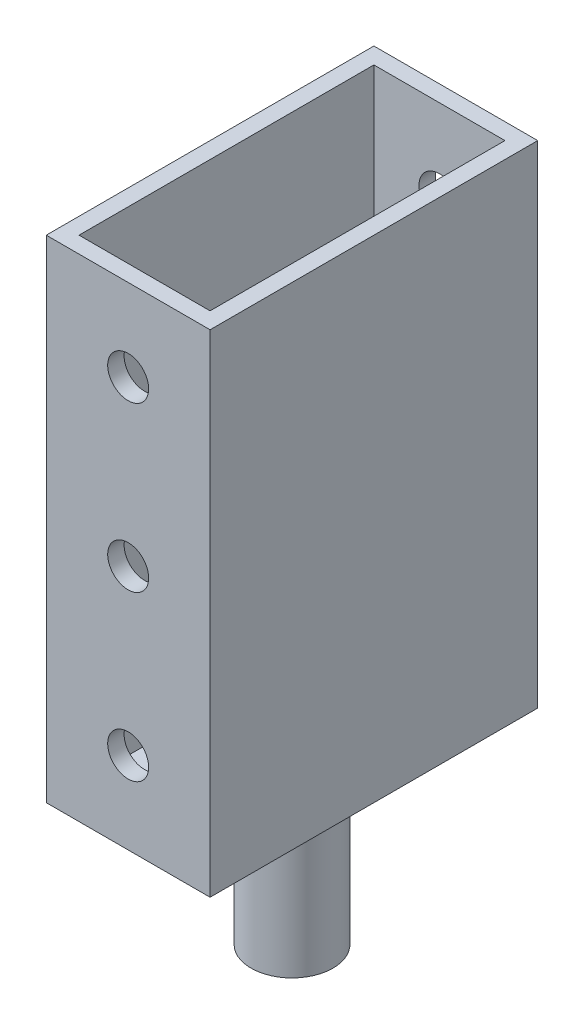
ISO-10303-21;
HEADER;
FILE_DESCRIPTION(('STEP AP214'),'2;1');
FILE_NAME('part.step','',(''),(''),'','','');
FILE_SCHEMA(('AUTOMOTIVE_DESIGN { 1 0 10303 214 1 1 1 1 }'));
ENDSEC;
DATA;
#1=APPLICATION_CONTEXT('core data for automotive mechanical design processes');
#2=APPLICATION_PROTOCOL_DEFINITION('international standard','automotive_design',2000,#1);
#3=PRODUCT_CONTEXT('',#1,'mechanical');
#4=PRODUCT('Part','Part','',(#3));
#5=PRODUCT_RELATED_PRODUCT_CATEGORY('part','',(#4));
#6=PRODUCT_DEFINITION_FORMATION('','',#4);
#7=PRODUCT_DEFINITION_CONTEXT('part definition',#1,'design');
#8=PRODUCT_DEFINITION('design','',#6,#7);
#9=PRODUCT_DEFINITION_SHAPE('','',#8);
#10=(LENGTH_UNIT() NAMED_UNIT(*) SI_UNIT(.MILLI.,.METRE.));
#11=(NAMED_UNIT(*) PLANE_ANGLE_UNIT() SI_UNIT($,.RADIAN.));
#12=(NAMED_UNIT(*) SI_UNIT($,.STERADIAN.) SOLID_ANGLE_UNIT());
#13=UNCERTAINTY_MEASURE_WITH_UNIT(LENGTH_MEASURE(1.E-05),#10,'distance_accuracy_value','');
#14=(GEOMETRIC_REPRESENTATION_CONTEXT(3) GLOBAL_UNCERTAINTY_ASSIGNED_CONTEXT((#13)) GLOBAL_UNIT_ASSIGNED_CONTEXT((#10,
#11,#12)) REPRESENTATION_CONTEXT('',''));
#15=CARTESIAN_POINT('',(0.,0.,0.));
#16=DIRECTION('',(0.,0.,1.));
#17=DIRECTION('',(1.,0.,0.));
#18=AXIS2_PLACEMENT_3D('',#15,#16,#17);
#19=CARTESIAN_POINT('',(12.7,63.5,-25.4));
#20=DIRECTION('',(0.,0.,1.));
#21=DIRECTION('',(1.,0.,0.));
#22=AXIS2_PLACEMENT_3D('',#19,#20,#21);
#23=CYLINDRICAL_SURFACE('',#22,3.175);
#24=CARTESIAN_POINT('',(12.7,63.5,-22.86));
#25=DIRECTION('',(0.,0.,-1.));
#26=DIRECTION('',(-1.,0.,0.));
#27=AXIS2_PLACEMENT_3D('',#24,#25,#26);
#28=CIRCLE('',#27,3.175);
#29=CARTESIAN_POINT('',(9.525,63.5,-22.86));
#30=VERTEX_POINT('',#29);
#31=EDGE_CURVE('E183',#30,#30,#28,.F.);
#32=ORIENTED_EDGE('',*,*,#31,.T.);
#33=EDGE_LOOP('',(#32));
#34=FACE_BOUND('',#33,.T.);
#35=CARTESIAN_POINT('',(12.7,63.5,-25.4));
#36=DIRECTION('',(0.,0.,1.));
#37=DIRECTION('',(1.,0.,0.));
#38=AXIS2_PLACEMENT_3D('',#35,#36,#37);
#39=CIRCLE('',#38,3.175);
#40=CARTESIAN_POINT('',(15.875,63.5,-25.4));
#41=VERTEX_POINT('',#40);
#42=EDGE_CURVE('E205',#41,#41,#39,.T.);
#43=ORIENTED_EDGE('',*,*,#42,.F.);
#44=EDGE_LOOP('',(#43));
#45=FACE_BOUND('',#44,.T.);
#46=ADVANCED_FACE('F39',(#34,#45),#23,.F.);
#47=CARTESIAN_POINT('',(12.7,38.1,-25.4));
#48=DIRECTION('',(0.,0.,1.));
#49=DIRECTION('',(1.,0.,0.));
#50=AXIS2_PLACEMENT_3D('',#47,#48,#49);
#51=CYLINDRICAL_SURFACE('',#50,3.175);
#52=CARTESIAN_POINT('',(12.7,38.1,-22.86));
#53=DIRECTION('',(0.,0.,-1.));
#54=DIRECTION('',(-1.,0.,0.));
#55=AXIS2_PLACEMENT_3D('',#52,#53,#54);
#56=CIRCLE('',#55,3.175);
#57=CARTESIAN_POINT('',(9.525,38.1,-22.86));
#58=VERTEX_POINT('',#57);
#59=EDGE_CURVE('E179',#58,#58,#56,.F.);
#60=ORIENTED_EDGE('',*,*,#59,.T.);
#61=EDGE_LOOP('',(#60));
#62=FACE_BOUND('',#61,.T.);
#63=CARTESIAN_POINT('',(12.7,38.1,-25.4));
#64=DIRECTION('',(0.,0.,1.));
#65=DIRECTION('',(1.,0.,0.));
#66=AXIS2_PLACEMENT_3D('',#63,#64,#65);
#67=CIRCLE('',#66,3.175);
#68=CARTESIAN_POINT('',(15.875,38.1,-25.4));
#69=VERTEX_POINT('',#68);
#70=EDGE_CURVE('E197',#69,#69,#67,.T.);
#71=ORIENTED_EDGE('',*,*,#70,.F.);
#72=EDGE_LOOP('',(#71));
#73=FACE_BOUND('',#72,.T.);
#74=ADVANCED_FACE('F289',(#62,#73),#51,.F.);
#75=CARTESIAN_POINT('',(12.7,12.7,-25.4));
#76=DIRECTION('',(0.,0.,1.));
#77=DIRECTION('',(1.,0.,0.));
#78=AXIS2_PLACEMENT_3D('',#75,#76,#77);
#79=CYLINDRICAL_SURFACE('',#78,3.175);
#80=CARTESIAN_POINT('',(12.7,12.7,-22.86));
#81=DIRECTION('',(0.,0.,-1.));
#82=DIRECTION('',(-1.,0.,0.));
#83=AXIS2_PLACEMENT_3D('',#80,#81,#82);
#84=CIRCLE('',#83,3.175);
#85=CARTESIAN_POINT('',(9.525,12.7,-22.86));
#86=VERTEX_POINT('',#85);
#87=EDGE_CURVE('E43',#86,#86,#84,.F.);
#88=ORIENTED_EDGE('',*,*,#87,.T.);
#89=EDGE_LOOP('',(#88));
#90=FACE_BOUND('',#89,.T.);
#91=CARTESIAN_POINT('',(12.7,12.7,-25.4));
#92=DIRECTION('',(0.,0.,1.));
#93=DIRECTION('',(1.,0.,0.));
#94=AXIS2_PLACEMENT_3D('',#91,#92,#93);
#95=CIRCLE('',#94,3.175);
#96=CARTESIAN_POINT('',(15.875,12.7,-25.4));
#97=VERTEX_POINT('',#96);
#98=EDGE_CURVE('E188',#97,#97,#95,.T.);
#99=ORIENTED_EDGE('',*,*,#98,.F.);
#100=EDGE_LOOP('',(#99));
#101=FACE_BOUND('',#100,.T.);
#102=ADVANCED_FACE('F294',(#90,#101),#79,.F.);
#103=CARTESIAN_POINT('',(0.,0.,25.4));
#104=DIRECTION('',(1.,0.,0.));
#105=DIRECTION('',(0.,0.,-1.));
#106=AXIS2_PLACEMENT_3D('',#103,#104,#105);
#107=PLANE('',#106);
#108=DIRECTION('',(0.,-1.,0.));
#109=VECTOR('',#108,1.);
#110=CARTESIAN_POINT('',(0.,0.,-25.4));
#111=LINE('',#110,#109);
#112=CARTESIAN_POINT('',(0.,76.2,-25.4));
#113=VERTEX_POINT('',#112);
#114=CARTESIAN_POINT('',(0.,0.,-25.4));
#115=VERTEX_POINT('',#114);
#116=EDGE_CURVE('E192',#113,#115,#111,.T.);
#117=ORIENTED_EDGE('',*,*,#116,.T.);
#118=DIRECTION('',(0.,0.,-1.));
#119=VECTOR('',#118,1.);
#120=CARTESIAN_POINT('',(0.,0.,25.4));
#121=LINE('',#120,#119);
#122=CARTESIAN_POINT('',(0.,0.,25.4));
#123=VERTEX_POINT('',#122);
#124=EDGE_CURVE('E49',#123,#115,#121,.T.);
#125=ORIENTED_EDGE('',*,*,#124,.F.);
#126=DIRECTION('',(0.,-1.,0.));
#127=VECTOR('',#126,1.);
#128=CARTESIAN_POINT('',(0.,0.,25.4));
#129=LINE('',#128,#127);
#130=CARTESIAN_POINT('',(0.,76.2,25.4));
#131=VERTEX_POINT('',#130);
#132=EDGE_CURVE('E212',#131,#123,#129,.T.);
#133=ORIENTED_EDGE('',*,*,#132,.F.);
#134=DIRECTION('',(0.,0.,-1.));
#135=VECTOR('',#134,1.);
#136=CARTESIAN_POINT('',(0.,76.2,25.4));
#137=LINE('',#136,#135);
#138=EDGE_CURVE('E222',#131,#113,#137,.T.);
#139=ORIENTED_EDGE('',*,*,#138,.T.);
#140=EDGE_LOOP('',(#117,#125,#133,#139));
#141=FACE_BOUND('',#140,.T.);
#142=ADVANCED_FACE('F41',(#141),#107,.F.);
#143=CARTESIAN_POINT('',(0.,0.,25.4));
#144=DIRECTION('',(0.,1.,0.));
#145=DIRECTION('',(0.,0.,1.));
#146=AXIS2_PLACEMENT_3D('',#143,#144,#145);
#147=PLANE('',#146);
#148=CARTESIAN_POINT('',(12.7,0.,0.));
#149=DIRECTION('',(0.,-1.,0.));
#150=DIRECTION('',(0.,0.,-1.));
#151=AXIS2_PLACEMENT_3D('',#148,#149,#150);
#152=CIRCLE('',#151,6.35);
#153=CARTESIAN_POINT('',(12.7,0.,-6.35));
#154=VERTEX_POINT('',#153);
#155=EDGE_CURVE('E11',#154,#154,#152,.T.);
#156=ORIENTED_EDGE('',*,*,#155,.F.);
#157=EDGE_LOOP('',(#156));
#158=FACE_BOUND('',#157,.T.);
#159=DIRECTION('',(1.,0.,0.));
#160=VECTOR('',#159,1.);
#161=CARTESIAN_POINT('',(0.,0.,-25.4));
#162=LINE('',#161,#160);
#163=CARTESIAN_POINT('',(25.4,0.,-25.4));
#164=VERTEX_POINT('',#163);
#165=EDGE_CURVE('E226',#115,#164,#162,.T.);
#166=ORIENTED_EDGE('',*,*,#165,.T.);
#167=DIRECTION('',(0.,0.,-1.));
#168=VECTOR('',#167,1.);
#169=CARTESIAN_POINT('',(25.4,0.,25.4));
#170=LINE('',#169,#168);
#171=CARTESIAN_POINT('',(25.4,0.,25.4));
#172=VERTEX_POINT('',#171);
#173=EDGE_CURVE('E239',#172,#164,#170,.T.);
#174=ORIENTED_EDGE('',*,*,#173,.F.);
#175=DIRECTION('',(1.,0.,0.));
#176=VECTOR('',#175,1.);
#177=CARTESIAN_POINT('',(0.,0.,25.4));
#178=LINE('',#177,#176);
#179=EDGE_CURVE('E95',#123,#172,#178,.T.);
#180=ORIENTED_EDGE('',*,*,#179,.F.);
#181=ORIENTED_EDGE('',*,*,#124,.T.);
#182=EDGE_LOOP('',(#166,#174,#180,#181));
#183=FACE_BOUND('',#182,.T.);
#184=ADVANCED_FACE('F274',(#158,#183),#147,.F.);
#185=CARTESIAN_POINT('',(25.4,0.,25.4));
#186=DIRECTION('',(-1.,0.,0.));
#187=DIRECTION('',(0.,0.,1.));
#188=AXIS2_PLACEMENT_3D('',#185,#186,#187);
#189=PLANE('',#188);
#190=DIRECTION('',(0.,1.,0.));
#191=VECTOR('',#190,1.);
#192=CARTESIAN_POINT('',(25.4,0.,-25.4));
#193=LINE('',#192,#191);
#194=CARTESIAN_POINT('',(25.4,76.2,-25.4));
#195=VERTEX_POINT('',#194);
#196=EDGE_CURVE('E229',#164,#195,#193,.T.);
#197=ORIENTED_EDGE('',*,*,#196,.T.);
#198=DIRECTION('',(0.,0.,-1.));
#199=VECTOR('',#198,1.);
#200=CARTESIAN_POINT('',(25.4,76.2,25.4));
#201=LINE('',#200,#199);
#202=CARTESIAN_POINT('',(25.4,76.2,25.4));
#203=VERTEX_POINT('',#202);
#204=EDGE_CURVE('E236',#203,#195,#201,.T.);
#205=ORIENTED_EDGE('',*,*,#204,.F.);
#206=DIRECTION('',(0.,1.,0.));
#207=VECTOR('',#206,1.);
#208=CARTESIAN_POINT('',(25.4,0.,25.4));
#209=LINE('',#208,#207);
#210=EDGE_CURVE('E217',#172,#203,#209,.T.);
#211=ORIENTED_EDGE('',*,*,#210,.F.);
#212=ORIENTED_EDGE('',*,*,#173,.T.);
#213=EDGE_LOOP('',(#197,#205,#211,#212));
#214=FACE_BOUND('',#213,.T.);
#215=ADVANCED_FACE('F279',(#214),#189,.F.);
#216=CARTESIAN_POINT('',(0.,76.2,25.4));
#217=DIRECTION('',(0.,-1.,0.));
#218=DIRECTION('',(0.,0.,-1.));
#219=AXIS2_PLACEMENT_3D('',#216,#217,#218);
#220=PLANE('',#219);
#221=DIRECTION('',(1.,0.,0.));
#222=VECTOR('',#221,1.);
#223=CARTESIAN_POINT('',(2.54,76.2,22.86));
#224=LINE('',#223,#222);
#225=CARTESIAN_POINT('',(2.54,76.2,22.86));
#226=VERTEX_POINT('',#225);
#227=CARTESIAN_POINT('',(22.86,76.2,22.86));
#228=VERTEX_POINT('',#227);
#229=EDGE_CURVE('E155',#226,#228,#224,.T.);
#230=ORIENTED_EDGE('',*,*,#229,.F.);
#231=DIRECTION('',(0.,0.,1.));
#232=VECTOR('',#231,1.);
#233=CARTESIAN_POINT('',(2.54,76.2,22.86));
#234=LINE('',#233,#232);
#235=CARTESIAN_POINT('',(2.54,76.2,-22.86));
#236=VERTEX_POINT('',#235);
#237=EDGE_CURVE('E57',#236,#226,#234,.T.);
#238=ORIENTED_EDGE('',*,*,#237,.F.);
#239=DIRECTION('',(-1.,0.,0.));
#240=VECTOR('',#239,1.);
#241=CARTESIAN_POINT('',(2.54,76.2,-22.86));
#242=LINE('',#241,#240);
#243=CARTESIAN_POINT('',(22.86,76.2,-22.86));
#244=VERTEX_POINT('',#243);
#245=EDGE_CURVE('E141',#244,#236,#242,.T.);
#246=ORIENTED_EDGE('',*,*,#245,.F.);
#247=DIRECTION('',(0.,0.,-1.));
#248=VECTOR('',#247,1.);
#249=CARTESIAN_POINT('',(22.86,76.2,22.86));
#250=LINE('',#249,#248);
#251=EDGE_CURVE('E145',#228,#244,#250,.T.);
#252=ORIENTED_EDGE('',*,*,#251,.F.);
#253=EDGE_LOOP('',(#230,#238,#246,#252));
#254=FACE_BOUND('',#253,.T.);
#255=DIRECTION('',(-1.,0.,0.));
#256=VECTOR('',#255,1.);
#257=CARTESIAN_POINT('',(0.,76.2,-25.4));
#258=LINE('',#257,#256);
#259=EDGE_CURVE('E87',#195,#113,#258,.T.);
#260=ORIENTED_EDGE('',*,*,#259,.T.);
#261=ORIENTED_EDGE('',*,*,#138,.F.);
#262=DIRECTION('',(-1.,0.,0.));
#263=VECTOR('',#262,1.);
#264=CARTESIAN_POINT('',(0.,76.2,25.4));
#265=LINE('',#264,#263);
#266=EDGE_CURVE('E66',#203,#131,#265,.T.);
#267=ORIENTED_EDGE('',*,*,#266,.F.);
#268=ORIENTED_EDGE('',*,*,#204,.T.);
#269=EDGE_LOOP('',(#260,#261,#267,#268));
#270=FACE_BOUND('',#269,.T.);
#271=ADVANCED_FACE('F267',(#254,#270),#220,.F.);
#272=CARTESIAN_POINT('',(0.,0.,25.4));
#273=DIRECTION('',(0.,0.,-1.));
#274=DIRECTION('',(-1.,0.,0.));
#275=AXIS2_PLACEMENT_3D('',#272,#273,#274);
#276=PLANE('',#275);
#277=CARTESIAN_POINT('',(12.7,12.7,25.4));
#278=DIRECTION('',(0.,0.,1.));
#279=DIRECTION('',(1.,0.,0.));
#280=AXIS2_PLACEMENT_3D('',#277,#278,#279);
#281=CIRCLE('',#280,3.175);
#282=CARTESIAN_POINT('',(15.875,12.7,25.4));
#283=VERTEX_POINT('',#282);
#284=EDGE_CURVE('E193',#283,#283,#281,.T.);
#285=ORIENTED_EDGE('',*,*,#284,.F.);
#286=EDGE_LOOP('',(#285));
#287=FACE_BOUND('',#286,.T.);
#288=CARTESIAN_POINT('',(12.7,38.1,25.4));
#289=DIRECTION('',(0.,0.,1.));
#290=DIRECTION('',(1.,0.,0.));
#291=AXIS2_PLACEMENT_3D('',#288,#289,#290);
#292=CIRCLE('',#291,3.175);
#293=CARTESIAN_POINT('',(15.875,38.1,25.4));
#294=VERTEX_POINT('',#293);
#295=EDGE_CURVE('E201',#294,#294,#292,.T.);
#296=ORIENTED_EDGE('',*,*,#295,.F.);
#297=EDGE_LOOP('',(#296));
#298=FACE_BOUND('',#297,.T.);
#299=CARTESIAN_POINT('',(12.7,63.5,25.4));
#300=DIRECTION('',(0.,0.,1.));
#301=DIRECTION('',(1.,0.,0.));
#302=AXIS2_PLACEMENT_3D('',#299,#300,#301);
#303=CIRCLE('',#302,3.175);
#304=CARTESIAN_POINT('',(15.875,63.5,25.4));
#305=VERTEX_POINT('',#304);
#306=EDGE_CURVE('E187',#305,#305,#303,.T.);
#307=ORIENTED_EDGE('',*,*,#306,.F.);
#308=EDGE_LOOP('',(#307));
#309=FACE_BOUND('',#308,.T.);
#310=ORIENTED_EDGE('',*,*,#132,.T.);
#311=ORIENTED_EDGE('',*,*,#179,.T.);
#312=ORIENTED_EDGE('',*,*,#210,.T.);
#313=ORIENTED_EDGE('',*,*,#266,.T.);
#314=EDGE_LOOP('',(#310,#311,#312,#313));
#315=FACE_BOUND('',#314,.T.);
#316=ADVANCED_FACE('F265',(#287,#298,#309,#315),#276,.F.);
#317=CARTESIAN_POINT('',(0.,0.,-25.4));
#318=DIRECTION('',(0.,0.,-1.));
#319=DIRECTION('',(-1.,0.,0.));
#320=AXIS2_PLACEMENT_3D('',#317,#318,#319);
#321=PLANE('',#320);
#322=ORIENTED_EDGE('',*,*,#98,.T.);
#323=EDGE_LOOP('',(#322));
#324=FACE_BOUND('',#323,.T.);
#325=ORIENTED_EDGE('',*,*,#70,.T.);
#326=EDGE_LOOP('',(#325));
#327=FACE_BOUND('',#326,.T.);
#328=ORIENTED_EDGE('',*,*,#42,.T.);
#329=EDGE_LOOP('',(#328));
#330=FACE_BOUND('',#329,.T.);
#331=ORIENTED_EDGE('',*,*,#116,.F.);
#332=ORIENTED_EDGE('',*,*,#259,.F.);
#333=ORIENTED_EDGE('',*,*,#196,.F.);
#334=ORIENTED_EDGE('',*,*,#165,.F.);
#335=EDGE_LOOP('',(#331,#332,#333,#334));
#336=FACE_BOUND('',#335,.T.);
#337=ADVANCED_FACE('F261',(#324,#327,#330,#336),#321,.T.);
#338=CARTESIAN_POINT('',(12.7,63.5,22.86));
#339=DIRECTION('',(0.,0.,1.));
#340=DIRECTION('',(1.,0.,0.));
#341=AXIS2_PLACEMENT_3D('',#338,#339,#340);
#342=CIRCLE('',#341,3.175);
#343=CARTESIAN_POINT('',(15.875,63.5,22.86));
#344=VERTEX_POINT('',#343);
#345=EDGE_CURVE('E175',#344,#344,#342,.F.);
#346=ORIENTED_EDGE('',*,*,#345,.T.);
#347=EDGE_LOOP('',(#346));
#348=FACE_BOUND('',#347,.T.);
#349=ORIENTED_EDGE('',*,*,#306,.T.);
#350=EDGE_LOOP('',(#349));
#351=FACE_BOUND('',#350,.T.);
#352=ADVANCED_FACE('F257',(#348,#351),#23,.F.);
#353=CARTESIAN_POINT('',(12.7,38.1,22.86));
#354=DIRECTION('',(0.,0.,1.));
#355=DIRECTION('',(1.,0.,0.));
#356=AXIS2_PLACEMENT_3D('',#353,#354,#355);
#357=CIRCLE('',#356,3.175);
#358=CARTESIAN_POINT('',(15.875,38.1,22.86));
#359=VERTEX_POINT('',#358);
#360=EDGE_CURVE('E171',#359,#359,#357,.F.);
#361=ORIENTED_EDGE('',*,*,#360,.T.);
#362=EDGE_LOOP('',(#361));
#363=FACE_BOUND('',#362,.T.);
#364=ORIENTED_EDGE('',*,*,#295,.T.);
#365=EDGE_LOOP('',(#364));
#366=FACE_BOUND('',#365,.T.);
#367=ADVANCED_FACE('F260',(#363,#366),#51,.F.);
#368=CARTESIAN_POINT('',(12.7,12.7,22.86));
#369=DIRECTION('',(0.,0.,1.));
#370=DIRECTION('',(1.,0.,0.));
#371=AXIS2_PLACEMENT_3D('',#368,#369,#370);
#372=CIRCLE('',#371,3.175);
#373=CARTESIAN_POINT('',(15.875,12.7,22.86));
#374=VERTEX_POINT('',#373);
#375=EDGE_CURVE('E165',#374,#374,#372,.F.);
#376=ORIENTED_EDGE('',*,*,#375,.T.);
#377=EDGE_LOOP('',(#376));
#378=FACE_BOUND('',#377,.T.);
#379=ORIENTED_EDGE('',*,*,#284,.T.);
#380=EDGE_LOOP('',(#379));
#381=FACE_BOUND('',#380,.T.);
#382=ADVANCED_FACE('F248',(#378,#381),#79,.F.);
#383=CARTESIAN_POINT('',(2.54,2.54000000000001,-22.86));
#384=DIRECTION('',(0.,0.,-1.));
#385=DIRECTION('',(-1.,0.,0.));
#386=AXIS2_PLACEMENT_3D('',#383,#384,#385);
#387=PLANE('',#386);
#388=ORIENTED_EDGE('',*,*,#59,.F.);
#389=EDGE_LOOP('',(#388));
#390=FACE_BOUND('',#389,.T.);
#391=ORIENTED_EDGE('',*,*,#245,.T.);
#392=DIRECTION('',(0.,1.,0.));
#393=VECTOR('',#392,1.);
#394=CARTESIAN_POINT('',(2.54,2.54000000000001,-22.86));
#395=LINE('',#394,#393);
#396=CARTESIAN_POINT('',(2.54,2.54000000000001,-22.86));
#397=VERTEX_POINT('',#396);
#398=EDGE_CURVE('E162',#397,#236,#395,.T.);
#399=ORIENTED_EDGE('',*,*,#398,.F.);
#400=DIRECTION('',(-1.,0.,0.));
#401=VECTOR('',#400,1.);
#402=CARTESIAN_POINT('',(2.54,2.54000000000001,-22.86));
#403=LINE('',#402,#401);
#404=CARTESIAN_POINT('',(22.86,2.54000000000001,-22.86));
#405=VERTEX_POINT('',#404);
#406=EDGE_CURVE('E126',#405,#397,#403,.T.);
#407=ORIENTED_EDGE('',*,*,#406,.F.);
#408=DIRECTION('',(0.,1.,0.));
#409=VECTOR('',#408,1.);
#410=CARTESIAN_POINT('',(22.86,2.54000000000001,-22.86));
#411=LINE('',#410,#409);
#412=EDGE_CURVE('E166',#405,#244,#411,.T.);
#413=ORIENTED_EDGE('',*,*,#412,.T.);
#414=EDGE_LOOP('',(#391,#399,#407,#413));
#415=FACE_BOUND('',#414,.T.);
#416=ORIENTED_EDGE('',*,*,#87,.F.);
#417=EDGE_LOOP('',(#416));
#418=FACE_BOUND('',#417,.T.);
#419=ORIENTED_EDGE('',*,*,#31,.F.);
#420=EDGE_LOOP('',(#419));
#421=FACE_BOUND('',#420,.T.);
#422=ADVANCED_FACE('F252',(#390,#415,#418,#421),#387,.F.);
#423=CARTESIAN_POINT('',(2.54,2.54000000000001,22.86));
#424=DIRECTION('',(0.,0.,1.));
#425=DIRECTION('',(1.,0.,0.));
#426=AXIS2_PLACEMENT_3D('',#423,#424,#425);
#427=PLANE('',#426);
#428=ORIENTED_EDGE('',*,*,#360,.F.);
#429=EDGE_LOOP('',(#428));
#430=FACE_BOUND('',#429,.T.);
#431=ORIENTED_EDGE('',*,*,#229,.T.);
#432=DIRECTION('',(0.,1.,0.));
#433=VECTOR('',#432,1.);
#434=CARTESIAN_POINT('',(22.86,2.54000000000001,22.86));
#435=LINE('',#434,#433);
#436=CARTESIAN_POINT('',(22.86,2.54000000000001,22.86));
#437=VERTEX_POINT('',#436);
#438=EDGE_CURVE('E125',#437,#228,#435,.T.);
#439=ORIENTED_EDGE('',*,*,#438,.F.);
#440=DIRECTION('',(1.,0.,0.));
#441=VECTOR('',#440,1.);
#442=CARTESIAN_POINT('',(2.54,2.54000000000001,22.86));
#443=LINE('',#442,#441);
#444=CARTESIAN_POINT('',(2.54,2.54000000000001,22.86));
#445=VERTEX_POINT('',#444);
#446=EDGE_CURVE('E129',#445,#437,#443,.T.);
#447=ORIENTED_EDGE('',*,*,#446,.F.);
#448=DIRECTION('',(0.,1.,0.));
#449=VECTOR('',#448,1.);
#450=CARTESIAN_POINT('',(2.54,2.54000000000001,22.86));
#451=LINE('',#450,#449);
#452=EDGE_CURVE('E115',#445,#226,#451,.T.);
#453=ORIENTED_EDGE('',*,*,#452,.T.);
#454=EDGE_LOOP('',(#431,#439,#447,#453));
#455=FACE_BOUND('',#454,.T.);
#456=ORIENTED_EDGE('',*,*,#375,.F.);
#457=EDGE_LOOP('',(#456));
#458=FACE_BOUND('',#457,.T.);
#459=ORIENTED_EDGE('',*,*,#345,.F.);
#460=EDGE_LOOP('',(#459));
#461=FACE_BOUND('',#460,.T.);
#462=ADVANCED_FACE('F130',(#430,#455,#458,#461),#427,.F.);
#463=CARTESIAN_POINT('',(2.54,2.54000000000001,22.86));
#464=DIRECTION('',(-1.,0.,0.));
#465=DIRECTION('',(0.,0.,1.));
#466=AXIS2_PLACEMENT_3D('',#463,#464,#465);
#467=PLANE('',#466);
#468=ORIENTED_EDGE('',*,*,#237,.T.);
#469=ORIENTED_EDGE('',*,*,#452,.F.);
#470=DIRECTION('',(0.,0.,1.));
#471=VECTOR('',#470,1.);
#472=CARTESIAN_POINT('',(2.54,2.54000000000001,22.86));
#473=LINE('',#472,#471);
#474=EDGE_CURVE('E119',#397,#445,#473,.T.);
#475=ORIENTED_EDGE('',*,*,#474,.F.);
#476=ORIENTED_EDGE('',*,*,#398,.T.);
#477=EDGE_LOOP('',(#468,#469,#475,#476));
#478=FACE_BOUND('',#477,.T.);
#479=ADVANCED_FACE('F117',(#478),#467,.F.);
#480=CARTESIAN_POINT('',(22.86,2.54000000000001,22.86));
#481=DIRECTION('',(1.,0.,0.));
#482=DIRECTION('',(0.,0.,-1.));
#483=AXIS2_PLACEMENT_3D('',#480,#481,#482);
#484=PLANE('',#483);
#485=ORIENTED_EDGE('',*,*,#251,.T.);
#486=ORIENTED_EDGE('',*,*,#412,.F.);
#487=DIRECTION('',(0.,0.,-1.));
#488=VECTOR('',#487,1.);
#489=CARTESIAN_POINT('',(22.86,2.54000000000001,22.86));
#490=LINE('',#489,#488);
#491=EDGE_CURVE('E136',#437,#405,#490,.T.);
#492=ORIENTED_EDGE('',*,*,#491,.F.);
#493=ORIENTED_EDGE('',*,*,#438,.T.);
#494=EDGE_LOOP('',(#485,#486,#492,#493));
#495=FACE_BOUND('',#494,.T.);
#496=ADVANCED_FACE('F304',(#495),#484,.F.);
#497=CARTESIAN_POINT('',(0.,2.54000000000001,0.));
#498=DIRECTION('',(0.,-1.,0.));
#499=DIRECTION('',(0.,0.,-1.));
#500=AXIS2_PLACEMENT_3D('',#497,#498,#499);
#501=PLANE('',#500);
#502=ORIENTED_EDGE('',*,*,#474,.T.);
#503=ORIENTED_EDGE('',*,*,#446,.T.);
#504=ORIENTED_EDGE('',*,*,#491,.T.);
#505=ORIENTED_EDGE('',*,*,#406,.T.);
#506=EDGE_LOOP('',(#502,#503,#504,#505));
#507=FACE_BOUND('',#506,.T.);
#508=ADVANCED_FACE('F138',(#507),#501,.F.);
#509=CARTESIAN_POINT('',(12.7,-25.4,0.));
#510=DIRECTION('',(0.,1.,0.));
#511=DIRECTION('',(0.,0.,1.));
#512=AXIS2_PLACEMENT_3D('',#509,#510,#511);
#513=CYLINDRICAL_SURFACE('',#512,6.35);
#514=CARTESIAN_POINT('',(12.7,-25.4,0.));
#515=DIRECTION('',(0.,-1.,0.));
#516=DIRECTION('',(0.,0.,-1.));
#517=AXIS2_PLACEMENT_3D('',#514,#515,#516);
#518=CIRCLE('',#517,6.35);
#519=CARTESIAN_POINT('',(12.7,-25.4,-6.35));
#520=VERTEX_POINT('',#519);
#521=EDGE_CURVE('E156',#520,#520,#518,.T.);
#522=ORIENTED_EDGE('',*,*,#521,.F.);
#523=EDGE_LOOP('',(#522));
#524=FACE_BOUND('',#523,.T.);
#525=ORIENTED_EDGE('',*,*,#155,.T.);
#526=EDGE_LOOP('',(#525));
#527=FACE_BOUND('',#526,.T.);
#528=ADVANCED_FACE('F314',(#524,#527),#513,.T.);
#529=CARTESIAN_POINT('',(12.7,-25.4,0.));
#530=DIRECTION('',(0.,-1.,0.));
#531=DIRECTION('',(0.,0.,-1.));
#532=AXIS2_PLACEMENT_3D('',#529,#530,#531);
#533=PLANE('',#532);
#534=ORIENTED_EDGE('',*,*,#521,.T.);
#535=EDGE_LOOP('',(#534));
#536=FACE_BOUND('',#535,.T.);
#537=ADVANCED_FACE('F317',(#536),#533,.T.);
#538=CLOSED_SHELL('',(#46,#74,#102,#142,#184,#215,#271,#316,#337,#352,#367,#382,#422,#462,#479,
#496,#508,#528,#537));
#539=MANIFOLD_SOLID_BREP('B2',#538);
#540=ADVANCED_BREP_SHAPE_REPRESENTATION('',(#18,#539),#14);
#541=SHAPE_DEFINITION_REPRESENTATION(#9,#540);
ENDSEC;
END-ISO-10303-21;
